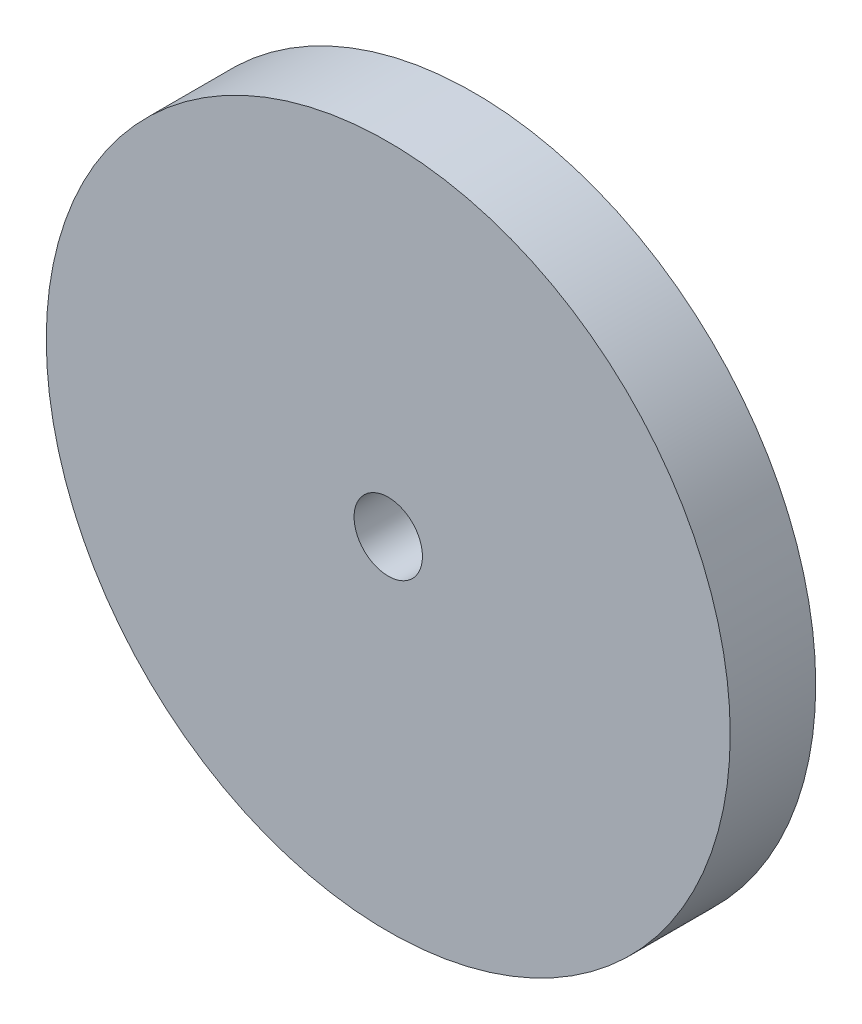
ISO-10303-21;
HEADER;
FILE_DESCRIPTION(('STEP AP214'),'2;1');
FILE_NAME('part.step','',(''),(''),'','','');
FILE_SCHEMA(('AUTOMOTIVE_DESIGN { 1 0 10303 214 1 1 1 1 }'));
ENDSEC;
DATA;
#1=APPLICATION_CONTEXT('core data for automotive mechanical design processes');
#2=APPLICATION_PROTOCOL_DEFINITION('international standard','automotive_design',2000,#1);
#3=PRODUCT_CONTEXT('',#1,'mechanical');
#4=PRODUCT('Part','Part','',(#3));
#5=PRODUCT_RELATED_PRODUCT_CATEGORY('part','',(#4));
#6=PRODUCT_DEFINITION_FORMATION('','',#4);
#7=PRODUCT_DEFINITION_CONTEXT('part definition',#1,'design');
#8=PRODUCT_DEFINITION('design','',#6,#7);
#9=PRODUCT_DEFINITION_SHAPE('','',#8);
#10=(LENGTH_UNIT() NAMED_UNIT(*) SI_UNIT(.MILLI.,.METRE.));
#11=(NAMED_UNIT(*) PLANE_ANGLE_UNIT() SI_UNIT($,.RADIAN.));
#12=(NAMED_UNIT(*) SI_UNIT($,.STERADIAN.) SOLID_ANGLE_UNIT());
#13=UNCERTAINTY_MEASURE_WITH_UNIT(LENGTH_MEASURE(1.E-05),#10,'distance_accuracy_value','');
#14=(GEOMETRIC_REPRESENTATION_CONTEXT(3) GLOBAL_UNCERTAINTY_ASSIGNED_CONTEXT((#13)) GLOBAL_UNIT_ASSIGNED_CONTEXT((#10,
#11,#12)) REPRESENTATION_CONTEXT('',''));
#15=CARTESIAN_POINT('',(0.,0.,0.));
#16=DIRECTION('',(0.,0.,1.));
#17=DIRECTION('',(1.,0.,0.));
#18=AXIS2_PLACEMENT_3D('',#15,#16,#17);
#19=CARTESIAN_POINT('',(0.,0.,2.5));
#20=DIRECTION('',(0.,0.,-1.));
#21=DIRECTION('',(-1.,0.,0.));
#22=AXIS2_PLACEMENT_3D('',#19,#20,#21);
#23=CYLINDRICAL_SURFACE('',#22,20.);
#24=CARTESIAN_POINT('',(0.,0.,2.5));
#25=DIRECTION('',(0.,0.,1.));
#26=DIRECTION('',(1.,0.,0.));
#27=AXIS2_PLACEMENT_3D('',#24,#25,#26);
#28=CIRCLE('',#27,20.);
#29=CARTESIAN_POINT('',(20.,0.,2.5));
#30=VERTEX_POINT('',#29);
#31=EDGE_CURVE('E10',#30,#30,#28,.T.);
#32=ORIENTED_EDGE('',*,*,#31,.F.);
#33=EDGE_LOOP('',(#32));
#34=FACE_BOUND('',#33,.T.);
#35=CARTESIAN_POINT('',(0.,0.,-2.5));
#36=DIRECTION('',(0.,0.,1.));
#37=DIRECTION('',(1.,0.,0.));
#38=AXIS2_PLACEMENT_3D('',#35,#36,#37);
#39=CIRCLE('',#38,20.);
#40=CARTESIAN_POINT('',(20.,0.,-2.5));
#41=VERTEX_POINT('',#40);
#42=EDGE_CURVE('E38',#41,#41,#39,.T.);
#43=ORIENTED_EDGE('',*,*,#42,.T.);
#44=EDGE_LOOP('',(#43));
#45=FACE_BOUND('',#44,.T.);
#46=ADVANCED_FACE('F35',(#34,#45),#23,.T.);
#47=CARTESIAN_POINT('',(0.,0.,2.5));
#48=DIRECTION('',(0.,0.,1.));
#49=DIRECTION('',(1.,0.,0.));
#50=AXIS2_PLACEMENT_3D('',#47,#48,#49);
#51=PLANE('',#50);
#52=CARTESIAN_POINT('',(0.,0.,2.5));
#53=DIRECTION('',(0.,0.,1.));
#54=DIRECTION('',(1.,0.,0.));
#55=AXIS2_PLACEMENT_3D('',#52,#53,#54);
#56=CIRCLE('',#55,2.);
#57=CARTESIAN_POINT('',(2.,0.,2.5));
#58=VERTEX_POINT('',#57);
#59=EDGE_CURVE('E49',#58,#58,#56,.T.);
#60=ORIENTED_EDGE('',*,*,#59,.F.);
#61=EDGE_LOOP('',(#60));
#62=FACE_BOUND('',#61,.T.);
#63=ORIENTED_EDGE('',*,*,#31,.T.);
#64=EDGE_LOOP('',(#63));
#65=FACE_BOUND('',#64,.T.);
#66=ADVANCED_FACE('F55',(#62,#65),#51,.T.);
#67=CARTESIAN_POINT('',(0.,0.,-2.5));
#68=DIRECTION('',(0.,0.,1.));
#69=DIRECTION('',(1.,0.,0.));
#70=AXIS2_PLACEMENT_3D('',#67,#68,#69);
#71=PLANE('',#70);
#72=CARTESIAN_POINT('',(0.,0.,-2.5));
#73=DIRECTION('',(0.,0.,1.));
#74=DIRECTION('',(1.,0.,0.));
#75=AXIS2_PLACEMENT_3D('',#72,#73,#74);
#76=CIRCLE('',#75,2.);
#77=CARTESIAN_POINT('',(2.,0.,-2.5));
#78=VERTEX_POINT('',#77);
#79=EDGE_CURVE('E45',#78,#78,#76,.F.);
#80=ORIENTED_EDGE('',*,*,#79,.F.);
#81=EDGE_LOOP('',(#80));
#82=FACE_BOUND('',#81,.T.);
#83=ORIENTED_EDGE('',*,*,#42,.F.);
#84=EDGE_LOOP('',(#83));
#85=FACE_BOUND('',#84,.T.);
#86=ADVANCED_FACE('F57',(#82,#85),#71,.F.);
#87=CARTESIAN_POINT('',(0.,0.,-8.15685424949238));
#88=DIRECTION('',(0.,0.,1.));
#89=DIRECTION('',(1.,0.,0.));
#90=AXIS2_PLACEMENT_3D('',#87,#88,#89);
#91=CYLINDRICAL_SURFACE('',#90,2.);
#92=ORIENTED_EDGE('',*,*,#79,.T.);
#93=EDGE_LOOP('',(#92));
#94=FACE_BOUND('',#93,.T.);
#95=ORIENTED_EDGE('',*,*,#59,.T.);
#96=EDGE_LOOP('',(#95));
#97=FACE_BOUND('',#96,.T.);
#98=ADVANCED_FACE('F53',(#94,#97),#91,.F.);
#99=CLOSED_SHELL('',(#46,#66,#86,#98));
#100=MANIFOLD_SOLID_BREP('B2',#99);
#101=ADVANCED_BREP_SHAPE_REPRESENTATION('',(#18,#100),#14);
#102=SHAPE_DEFINITION_REPRESENTATION(#9,#101);
ENDSEC;
END-ISO-10303-21;
